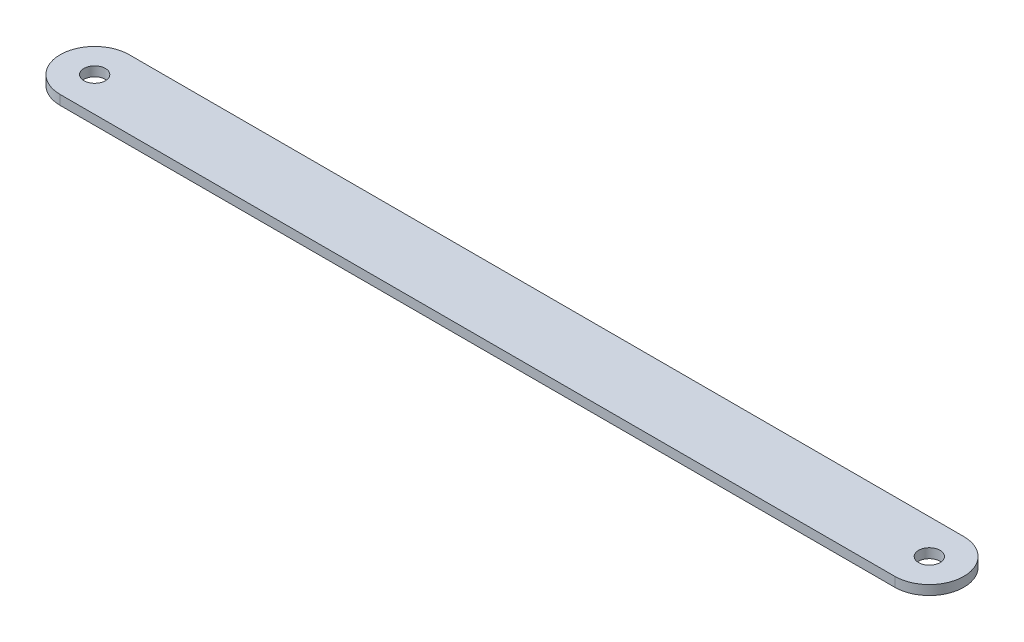
ISO-10303-21;
HEADER;
FILE_DESCRIPTION(('STEP AP214'),'2;1');
FILE_NAME('part.step','',(''),(''),'','','');
FILE_SCHEMA(('AUTOMOTIVE_DESIGN { 1 0 10303 214 1 1 1 1 }'));
ENDSEC;
DATA;
#1=APPLICATION_CONTEXT('core data for automotive mechanical design processes');
#2=APPLICATION_PROTOCOL_DEFINITION('international standard','automotive_design',2000,#1);
#3=PRODUCT_CONTEXT('',#1,'mechanical');
#4=PRODUCT('Part','Part','',(#3));
#5=PRODUCT_RELATED_PRODUCT_CATEGORY('part','',(#4));
#6=PRODUCT_DEFINITION_FORMATION('','',#4);
#7=PRODUCT_DEFINITION_CONTEXT('part definition',#1,'design');
#8=PRODUCT_DEFINITION('design','',#6,#7);
#9=PRODUCT_DEFINITION_SHAPE('','',#8);
#10=(LENGTH_UNIT() NAMED_UNIT(*) SI_UNIT(.MILLI.,.METRE.));
#11=(NAMED_UNIT(*) PLANE_ANGLE_UNIT() SI_UNIT($,.RADIAN.));
#12=(NAMED_UNIT(*) SI_UNIT($,.STERADIAN.) SOLID_ANGLE_UNIT());
#13=UNCERTAINTY_MEASURE_WITH_UNIT(LENGTH_MEASURE(1.E-05),#10,'distance_accuracy_value','');
#14=(GEOMETRIC_REPRESENTATION_CONTEXT(3) GLOBAL_UNCERTAINTY_ASSIGNED_CONTEXT((#13)) GLOBAL_UNIT_ASSIGNED_CONTEXT((#10,
#11,#12)) REPRESENTATION_CONTEXT('',''));
#15=CARTESIAN_POINT('',(0.,0.,0.));
#16=DIRECTION('',(0.,0.,1.));
#17=DIRECTION('',(1.,0.,0.));
#18=AXIS2_PLACEMENT_3D('',#15,#16,#17);
#19=CARTESIAN_POINT('',(-270.,4.,0.));
#20=DIRECTION('',(0.,-1.,0.));
#21=DIRECTION('',(0.,0.,-1.));
#22=AXIS2_PLACEMENT_3D('',#19,#20,#21);
#23=PLANE('',#22);
#24=CARTESIAN_POINT('',(-175.463800792768,4.,-325.5));
#25=DIRECTION('',(0.,1.,0.));
#26=DIRECTION('',(0.,0.,1.));
#27=AXIS2_PLACEMENT_3D('',#24,#25,#26);
#28=CIRCLE('',#27,14.5);
#29=CARTESIAN_POINT('',(-175.463800792768,4.,-340.));
#30=VERTEX_POINT('',#29);
#31=CARTESIAN_POINT('',(-175.463800792768,4.,-311.));
#32=VERTEX_POINT('',#31);
#33=EDGE_CURVE('E90',#30,#32,#28,.T.);
#34=ORIENTED_EDGE('',*,*,#33,.T.);
#35=DIRECTION('',(-1.,0.,0.));
#36=VECTOR('',#35,1.);
#37=CARTESIAN_POINT('',(-175.463800792768,4.,-311.));
#38=LINE('',#37,#36);
#39=CARTESIAN_POINT('',(175.463800792768,4.,-311.));
#40=VERTEX_POINT('',#39);
#41=EDGE_CURVE('E84',#40,#32,#38,.T.);
#42=ORIENTED_EDGE('',*,*,#41,.F.);
#43=CARTESIAN_POINT('',(175.463800792768,4.,-325.5));
#44=DIRECTION('',(0.,-1.,0.));
#45=DIRECTION('',(0.,0.,1.));
#46=AXIS2_PLACEMENT_3D('',#43,#44,#45);
#47=CIRCLE('',#46,14.5);
#48=CARTESIAN_POINT('',(175.463800792768,4.,-340.));
#49=VERTEX_POINT('',#48);
#50=EDGE_CURVE('E70',#49,#40,#47,.T.);
#51=ORIENTED_EDGE('',*,*,#50,.F.);
#52=DIRECTION('',(-1.,0.,0.));
#53=VECTOR('',#52,1.);
#54=CARTESIAN_POINT('',(-175.463800792768,4.,-340.));
#55=LINE('',#54,#53);
#56=EDGE_CURVE('E48',#49,#30,#55,.T.);
#57=ORIENTED_EDGE('',*,*,#56,.T.);
#58=EDGE_LOOP('',(#34,#42,#51,#57));
#59=FACE_BOUND('',#58,.T.);
#60=CARTESIAN_POINT('',(-175.463800792768,4.,-325.5));
#61=DIRECTION('',(0.,1.,0.));
#62=DIRECTION('',(0.,0.,1.));
#63=AXIS2_PLACEMENT_3D('',#60,#61,#62);
#64=CIRCLE('',#63,4.49999999999999);
#65=CARTESIAN_POINT('',(-175.463800792768,4.,-321.));
#66=VERTEX_POINT('',#65);
#67=EDGE_CURVE('E104',#66,#66,#64,.T.);
#68=ORIENTED_EDGE('',*,*,#67,.F.);
#69=EDGE_LOOP('',(#68));
#70=FACE_BOUND('',#69,.T.);
#71=CARTESIAN_POINT('',(175.463800792768,4.,-325.5));
#72=DIRECTION('',(0.,-1.,0.));
#73=DIRECTION('',(0.,0.,1.));
#74=AXIS2_PLACEMENT_3D('',#71,#72,#73);
#75=CIRCLE('',#74,4.49999999999999);
#76=CARTESIAN_POINT('',(175.463800792768,4.,-321.));
#77=VERTEX_POINT('',#76);
#78=EDGE_CURVE('E96',#77,#77,#75,.T.);
#79=ORIENTED_EDGE('',*,*,#78,.T.);
#80=EDGE_LOOP('',(#79));
#81=FACE_BOUND('',#80,.T.);
#82=ADVANCED_FACE('F33',(#59,#70,#81),#23,.F.);
#83=CARTESIAN_POINT('',(-270.,0.,0.));
#84=DIRECTION('',(0.,-1.,0.));
#85=DIRECTION('',(0.,0.,-1.));
#86=AXIS2_PLACEMENT_3D('',#83,#84,#85);
#87=PLANE('',#86);
#88=DIRECTION('',(1.,0.,0.));
#89=VECTOR('',#88,1.);
#90=CARTESIAN_POINT('',(-270.,0.,-311.));
#91=LINE('',#90,#89);
#92=CARTESIAN_POINT('',(-175.463800792768,0.,-311.));
#93=VERTEX_POINT('',#92);
#94=CARTESIAN_POINT('',(175.463800792768,0.,-311.));
#95=VERTEX_POINT('',#94);
#96=EDGE_CURVE('E11',#93,#95,#91,.T.);
#97=ORIENTED_EDGE('',*,*,#96,.F.);
#98=CARTESIAN_POINT('',(-175.463800792768,0.,-325.5));
#99=DIRECTION('',(0.,1.,0.));
#100=DIRECTION('',(0.,0.,1.));
#101=AXIS2_PLACEMENT_3D('',#98,#99,#100);
#102=CIRCLE('',#101,14.5);
#103=CARTESIAN_POINT('',(-175.463800792768,0.,-340.));
#104=VERTEX_POINT('',#103);
#105=EDGE_CURVE('E111',#104,#93,#102,.T.);
#106=ORIENTED_EDGE('',*,*,#105,.F.);
#107=DIRECTION('',(-1.,0.,0.));
#108=VECTOR('',#107,1.);
#109=CARTESIAN_POINT('',(-175.463800792768,0.,-340.));
#110=LINE('',#109,#108);
#111=CARTESIAN_POINT('',(175.463800792768,0.,-340.));
#112=VERTEX_POINT('',#111);
#113=EDGE_CURVE('E107',#112,#104,#110,.T.);
#114=ORIENTED_EDGE('',*,*,#113,.F.);
#115=CARTESIAN_POINT('',(175.463800792768,0.,-325.5));
#116=DIRECTION('',(0.,-1.,0.));
#117=DIRECTION('',(0.,0.,1.));
#118=AXIS2_PLACEMENT_3D('',#115,#116,#117);
#119=CIRCLE('',#118,14.5);
#120=EDGE_CURVE('E78',#112,#95,#119,.T.);
#121=ORIENTED_EDGE('',*,*,#120,.T.);
#122=EDGE_LOOP('',(#97,#106,#114,#121));
#123=FACE_BOUND('',#122,.T.);
#124=CARTESIAN_POINT('',(-175.463800792768,0.,-325.5));
#125=DIRECTION('',(0.,1.,0.));
#126=DIRECTION('',(0.,0.,1.));
#127=AXIS2_PLACEMENT_3D('',#124,#125,#126);
#128=CIRCLE('',#127,4.49999999999999);
#129=CARTESIAN_POINT('',(-175.463800792768,0.,-321.));
#130=VERTEX_POINT('',#129);
#131=EDGE_CURVE('E103',#130,#130,#128,.T.);
#132=ORIENTED_EDGE('',*,*,#131,.T.);
#133=EDGE_LOOP('',(#132));
#134=FACE_BOUND('',#133,.T.);
#135=CARTESIAN_POINT('',(175.463800792768,0.,-325.5));
#136=DIRECTION('',(0.,-1.,0.));
#137=DIRECTION('',(0.,0.,1.));
#138=AXIS2_PLACEMENT_3D('',#135,#136,#137);
#139=CIRCLE('',#138,4.49999999999999);
#140=CARTESIAN_POINT('',(175.463800792768,0.,-321.));
#141=VERTEX_POINT('',#140);
#142=EDGE_CURVE('E94',#141,#141,#139,.T.);
#143=ORIENTED_EDGE('',*,*,#142,.F.);
#144=EDGE_LOOP('',(#143));
#145=FACE_BOUND('',#144,.T.);
#146=ADVANCED_FACE('F120',(#123,#134,#145),#87,.T.);
#147=CARTESIAN_POINT('',(-175.463800792768,4.,-340.));
#148=DIRECTION('',(0.,0.,1.));
#149=DIRECTION('',(1.,0.,0.));
#150=AXIS2_PLACEMENT_3D('',#147,#148,#149);
#151=PLANE('',#150);
#152=ORIENTED_EDGE('',*,*,#113,.T.);
#153=DIRECTION('',(0.,-1.,0.));
#154=VECTOR('',#153,1.);
#155=CARTESIAN_POINT('',(-175.463800792768,4.,-340.));
#156=LINE('',#155,#154);
#157=EDGE_CURVE('E42',#30,#104,#156,.T.);
#158=ORIENTED_EDGE('',*,*,#157,.F.);
#159=ORIENTED_EDGE('',*,*,#56,.F.);
#160=DIRECTION('',(0.,-1.,0.));
#161=VECTOR('',#160,1.);
#162=CARTESIAN_POINT('',(175.463800792768,4.,-340.));
#163=LINE('',#162,#161);
#164=EDGE_CURVE('E76',#49,#112,#163,.T.);
#165=ORIENTED_EDGE('',*,*,#164,.T.);
#166=EDGE_LOOP('',(#152,#158,#159,#165));
#167=FACE_BOUND('',#166,.T.);
#168=ADVANCED_FACE('F35',(#167),#151,.F.);
#169=CARTESIAN_POINT('',(-175.463800792768,4.,-325.5));
#170=DIRECTION('',(0.,-1.,0.));
#171=DIRECTION('',(0.,0.,-1.));
#172=AXIS2_PLACEMENT_3D('',#169,#170,#171);
#173=CYLINDRICAL_SURFACE('',#172,14.5);
#174=ORIENTED_EDGE('',*,*,#105,.T.);
#175=DIRECTION('',(0.,1.,0.));
#176=VECTOR('',#175,1.);
#177=CARTESIAN_POINT('',(-175.463800792768,-6.,-311.));
#178=LINE('',#177,#176);
#179=EDGE_CURVE('E86',#93,#32,#178,.T.);
#180=ORIENTED_EDGE('',*,*,#179,.T.);
#181=ORIENTED_EDGE('',*,*,#33,.F.);
#182=ORIENTED_EDGE('',*,*,#157,.T.);
#183=EDGE_LOOP('',(#174,#180,#181,#182));
#184=FACE_BOUND('',#183,.T.);
#185=ADVANCED_FACE('F117',(#184),#173,.T.);
#186=CARTESIAN_POINT('',(-175.463800792768,4.,-325.5));
#187=DIRECTION('',(0.,-1.,0.));
#188=DIRECTION('',(0.,0.,-1.));
#189=AXIS2_PLACEMENT_3D('',#186,#187,#188);
#190=CYLINDRICAL_SURFACE('',#189,4.49999999999999);
#191=ORIENTED_EDGE('',*,*,#67,.T.);
#192=EDGE_LOOP('',(#191));
#193=FACE_BOUND('',#192,.T.);
#194=ORIENTED_EDGE('',*,*,#131,.F.);
#195=EDGE_LOOP('',(#194));
#196=FACE_BOUND('',#195,.T.);
#197=ADVANCED_FACE('F128',(#193,#196),#190,.F.);
#198=CARTESIAN_POINT('',(175.463800792768,4.,-325.5));
#199=DIRECTION('',(0.,-1.,0.));
#200=DIRECTION('',(0.,0.,-1.));
#201=AXIS2_PLACEMENT_3D('',#198,#199,#200);
#202=CYLINDRICAL_SURFACE('',#201,14.5);
#203=ORIENTED_EDGE('',*,*,#120,.F.);
#204=ORIENTED_EDGE('',*,*,#164,.F.);
#205=ORIENTED_EDGE('',*,*,#50,.T.);
#206=DIRECTION('',(0.,1.,0.));
#207=VECTOR('',#206,1.);
#208=CARTESIAN_POINT('',(175.463800792768,-6.,-311.));
#209=LINE('',#208,#207);
#210=EDGE_CURVE('E74',#95,#40,#209,.T.);
#211=ORIENTED_EDGE('',*,*,#210,.F.);
#212=EDGE_LOOP('',(#203,#204,#205,#211));
#213=FACE_BOUND('',#212,.T.);
#214=ADVANCED_FACE('F73',(#213),#202,.T.);
#215=CARTESIAN_POINT('',(175.463800792768,4.,-325.5));
#216=DIRECTION('',(0.,-1.,0.));
#217=DIRECTION('',(0.,0.,-1.));
#218=AXIS2_PLACEMENT_3D('',#215,#216,#217);
#219=CYLINDRICAL_SURFACE('',#218,4.49999999999999);
#220=ORIENTED_EDGE('',*,*,#78,.F.);
#221=EDGE_LOOP('',(#220));
#222=FACE_BOUND('',#221,.T.);
#223=ORIENTED_EDGE('',*,*,#142,.T.);
#224=EDGE_LOOP('',(#223));
#225=FACE_BOUND('',#224,.T.);
#226=ADVANCED_FACE('F141',(#222,#225),#219,.F.);
#227=CARTESIAN_POINT('',(-175.463800792768,-6.,-311.));
#228=DIRECTION('',(0.,0.,-1.));
#229=DIRECTION('',(-1.,0.,0.));
#230=AXIS2_PLACEMENT_3D('',#227,#228,#229);
#231=PLANE('',#230);
#232=ORIENTED_EDGE('',*,*,#96,.T.);
#233=ORIENTED_EDGE('',*,*,#210,.T.);
#234=ORIENTED_EDGE('',*,*,#41,.T.);
#235=ORIENTED_EDGE('',*,*,#179,.F.);
#236=EDGE_LOOP('',(#232,#233,#234,#235));
#237=FACE_BOUND('',#236,.T.);
#238=ADVANCED_FACE('F82',(#237),#231,.F.);
#239=CLOSED_SHELL('',(#82,#146,#168,#185,#197,#214,#226,#238));
#240=MANIFOLD_SOLID_BREP('B2',#239);
#241=ADVANCED_BREP_SHAPE_REPRESENTATION('',(#18,#240),#14);
#242=SHAPE_DEFINITION_REPRESENTATION(#9,#241);
ENDSEC;
END-ISO-10303-21;
